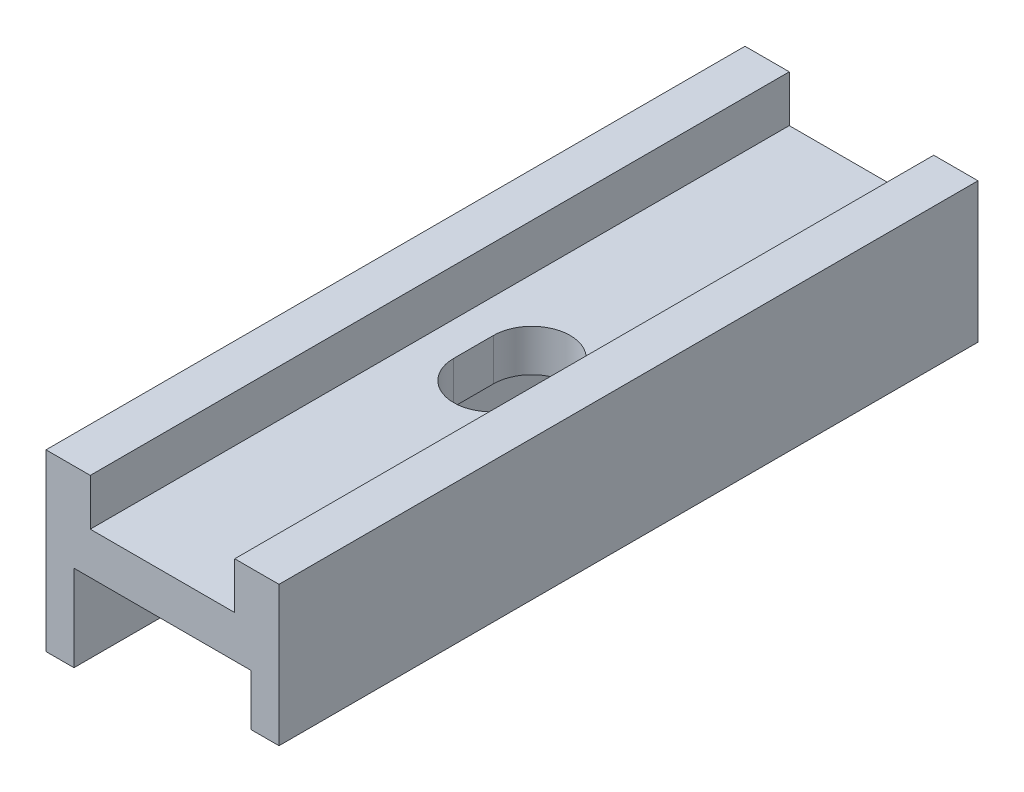
ISO-10303-21;
HEADER;
FILE_DESCRIPTION(('STEP AP214'),'2;1');
FILE_NAME('part.step','',(''),(''),'','','');
FILE_SCHEMA(('AUTOMOTIVE_DESIGN { 1 0 10303 214 1 1 1 1 }'));
ENDSEC;
DATA;
#1=APPLICATION_CONTEXT('core data for automotive mechanical design processes');
#2=APPLICATION_PROTOCOL_DEFINITION('international standard','automotive_design',2000,#1);
#3=PRODUCT_CONTEXT('',#1,'mechanical');
#4=PRODUCT('Part','Part','',(#3));
#5=PRODUCT_RELATED_PRODUCT_CATEGORY('part','',(#4));
#6=PRODUCT_DEFINITION_FORMATION('','',#4);
#7=PRODUCT_DEFINITION_CONTEXT('part definition',#1,'design');
#8=PRODUCT_DEFINITION('design','',#6,#7);
#9=PRODUCT_DEFINITION_SHAPE('','',#8);
#10=(LENGTH_UNIT() NAMED_UNIT(*) SI_UNIT(.MILLI.,.METRE.));
#11=(NAMED_UNIT(*) PLANE_ANGLE_UNIT() SI_UNIT($,.RADIAN.));
#12=(NAMED_UNIT(*) SI_UNIT($,.STERADIAN.) SOLID_ANGLE_UNIT());
#13=UNCERTAINTY_MEASURE_WITH_UNIT(LENGTH_MEASURE(1.E-05),#10,'distance_accuracy_value','');
#14=(GEOMETRIC_REPRESENTATION_CONTEXT(3) GLOBAL_UNCERTAINTY_ASSIGNED_CONTEXT((#13)) GLOBAL_UNIT_ASSIGNED_CONTEXT((#10,
#11,#12)) REPRESENTATION_CONTEXT('',''));
#15=CARTESIAN_POINT('',(0.,0.,0.));
#16=DIRECTION('',(0.,0.,1.));
#17=DIRECTION('',(1.,0.,0.));
#18=AXIS2_PLACEMENT_3D('',#15,#16,#17);
#19=CARTESIAN_POINT('',(7.87400000000001,2.53999999999999,38.1));
#20=DIRECTION('',(-1.,0.,0.));
#21=DIRECTION('',(0.,-1.,0.));
#22=AXIS2_PLACEMENT_3D('',#19,#20,#21);
#23=PLANE('',#22);
#24=DIRECTION('',(0.,1.,0.));
#25=VECTOR('',#24,1.);
#26=CARTESIAN_POINT('',(7.87400000000001,2.53999999999999,-38.1));
#27=LINE('',#26,#25);
#28=CARTESIAN_POINT('',(7.87400000000001,2.53999999999999,-38.1));
#29=VERTEX_POINT('',#28);
#30=CARTESIAN_POINT('',(7.874,7.62,-38.1));
#31=VERTEX_POINT('',#30);
#32=EDGE_CURVE('E159',#29,#31,#27,.T.);
#33=ORIENTED_EDGE('',*,*,#32,.F.);
#34=DIRECTION('',(0.,0.,-1.));
#35=VECTOR('',#34,1.);
#36=CARTESIAN_POINT('',(7.87400000000001,2.53999999999999,38.1));
#37=LINE('',#36,#35);
#38=CARTESIAN_POINT('',(7.87400000000001,2.53999999999999,38.1));
#39=VERTEX_POINT('',#38);
#40=EDGE_CURVE('E11',#39,#29,#37,.T.);
#41=ORIENTED_EDGE('',*,*,#40,.F.);
#42=DIRECTION('',(0.,1.,0.));
#43=VECTOR('',#42,1.);
#44=CARTESIAN_POINT('',(7.87400000000001,2.53999999999999,38.1));
#45=LINE('',#44,#43);
#46=CARTESIAN_POINT('',(7.874,7.62,38.1));
#47=VERTEX_POINT('',#46);
#48=EDGE_CURVE('E198',#39,#47,#45,.T.);
#49=ORIENTED_EDGE('',*,*,#48,.T.);
#50=DIRECTION('',(0.,0.,-1.));
#51=VECTOR('',#50,1.);
#52=CARTESIAN_POINT('',(7.874,7.62,38.1));
#53=LINE('',#52,#51);
#54=EDGE_CURVE('E41',#47,#31,#53,.T.);
#55=ORIENTED_EDGE('',*,*,#54,.T.);
#56=EDGE_LOOP('',(#33,#41,#49,#55));
#57=FACE_BOUND('',#56,.T.);
#58=ADVANCED_FACE('F38',(#57),#23,.T.);
#59=CARTESIAN_POINT('',(-7.87400000000001,2.53999999999999,38.1));
#60=DIRECTION('',(0.,1.,0.));
#61=DIRECTION('',(0.,0.,1.));
#62=AXIS2_PLACEMENT_3D('',#59,#60,#61);
#63=PLANE('',#62);
#64=DIRECTION('',(0.,0.,1.));
#65=VECTOR('',#64,1.);
#66=CARTESIAN_POINT('',(-4.191,2.53999999999999,-2.159));
#67=LINE('',#66,#65);
#68=CARTESIAN_POINT('',(-4.191,2.53999999999999,-2.159));
#69=VERTEX_POINT('',#68);
#70=CARTESIAN_POINT('',(-4.191,2.53999999999999,2.159));
#71=VERTEX_POINT('',#70);
#72=EDGE_CURVE('E55',#69,#71,#67,.T.);
#73=ORIENTED_EDGE('',*,*,#72,.F.);
#74=CARTESIAN_POINT('',(0.,2.53999999999999,-2.159));
#75=DIRECTION('',(0.,1.,0.));
#76=DIRECTION('',(0.,0.,1.));
#77=AXIS2_PLACEMENT_3D('',#74,#75,#76);
#78=CIRCLE('',#77,4.191);
#79=CARTESIAN_POINT('',(4.191,2.53999999999999,-2.159));
#80=VERTEX_POINT('',#79);
#81=EDGE_CURVE('E166',#80,#69,#78,.T.);
#82=ORIENTED_EDGE('',*,*,#81,.F.);
#83=DIRECTION('',(0.,0.,1.));
#84=VECTOR('',#83,1.);
#85=CARTESIAN_POINT('',(4.191,2.53999999999999,-2.159));
#86=LINE('',#85,#84);
#87=CARTESIAN_POINT('',(4.191,2.53999999999999,2.159));
#88=VERTEX_POINT('',#87);
#89=EDGE_CURVE('E184',#80,#88,#86,.T.);
#90=ORIENTED_EDGE('',*,*,#89,.T.);
#91=CARTESIAN_POINT('',(0.,2.53999999999999,2.159));
#92=DIRECTION('',(0.,1.,0.));
#93=DIRECTION('',(0.,0.,1.));
#94=AXIS2_PLACEMENT_3D('',#91,#92,#93);
#95=CIRCLE('',#94,4.191);
#96=EDGE_CURVE('E176',#71,#88,#95,.T.);
#97=ORIENTED_EDGE('',*,*,#96,.F.);
#98=EDGE_LOOP('',(#73,#82,#90,#97));
#99=FACE_BOUND('',#98,.T.);
#100=DIRECTION('',(1.,0.,0.));
#101=VECTOR('',#100,1.);
#102=CARTESIAN_POINT('',(-7.87400000000001,2.53999999999999,-38.1));
#103=LINE('',#102,#101);
#104=CARTESIAN_POINT('',(-7.87400000000001,2.53999999999999,-38.1));
#105=VERTEX_POINT('',#104);
#106=EDGE_CURVE('E203',#105,#29,#103,.T.);
#107=ORIENTED_EDGE('',*,*,#106,.F.);
#108=DIRECTION('',(0.,0.,-1.));
#109=VECTOR('',#108,1.);
#110=CARTESIAN_POINT('',(-7.87400000000001,2.53999999999999,38.1));
#111=LINE('',#110,#109);
#112=CARTESIAN_POINT('',(-7.87400000000001,2.53999999999999,38.1));
#113=VERTEX_POINT('',#112);
#114=EDGE_CURVE('E47',#113,#105,#111,.T.);
#115=ORIENTED_EDGE('',*,*,#114,.F.);
#116=DIRECTION('',(1.,0.,0.));
#117=VECTOR('',#116,1.);
#118=CARTESIAN_POINT('',(-7.87400000000001,2.53999999999999,38.1));
#119=LINE('',#118,#117);
#120=EDGE_CURVE('E243',#113,#39,#119,.T.);
#121=ORIENTED_EDGE('',*,*,#120,.T.);
#122=ORIENTED_EDGE('',*,*,#40,.T.);
#123=EDGE_LOOP('',(#107,#115,#121,#122));
#124=FACE_BOUND('',#123,.T.);
#125=ADVANCED_FACE('F334',(#99,#124),#63,.T.);
#126=CARTESIAN_POINT('',(-7.874,7.62,38.1));
#127=DIRECTION('',(1.,0.,0.));
#128=DIRECTION('',(0.,1.,0.));
#129=AXIS2_PLACEMENT_3D('',#126,#127,#128);
#130=PLANE('',#129);
#131=DIRECTION('',(0.,-1.,0.));
#132=VECTOR('',#131,1.);
#133=CARTESIAN_POINT('',(-7.874,7.62,-38.1));
#134=LINE('',#133,#132);
#135=CARTESIAN_POINT('',(-7.874,7.62,-38.1));
#136=VERTEX_POINT('',#135);
#137=EDGE_CURVE('E286',#136,#105,#134,.T.);
#138=ORIENTED_EDGE('',*,*,#137,.F.);
#139=DIRECTION('',(0.,0.,-1.));
#140=VECTOR('',#139,1.);
#141=CARTESIAN_POINT('',(-7.874,7.62,38.1));
#142=LINE('',#141,#140);
#143=CARTESIAN_POINT('',(-7.874,7.62,38.1));
#144=VERTEX_POINT('',#143);
#145=EDGE_CURVE('E295',#144,#136,#142,.T.);
#146=ORIENTED_EDGE('',*,*,#145,.F.);
#147=DIRECTION('',(0.,-1.,0.));
#148=VECTOR('',#147,1.);
#149=CARTESIAN_POINT('',(-7.874,7.62,38.1));
#150=LINE('',#149,#148);
#151=EDGE_CURVE('E239',#144,#113,#150,.T.);
#152=ORIENTED_EDGE('',*,*,#151,.T.);
#153=ORIENTED_EDGE('',*,*,#114,.T.);
#154=EDGE_LOOP('',(#138,#146,#152,#153));
#155=FACE_BOUND('',#154,.T.);
#156=ADVANCED_FACE('F369',(#155),#130,.T.);
#157=CARTESIAN_POINT('',(-12.7,7.62,38.1));
#158=DIRECTION('',(0.,1.,0.));
#159=DIRECTION('',(0.,0.,1.));
#160=AXIS2_PLACEMENT_3D('',#157,#158,#159);
#161=PLANE('',#160);
#162=DIRECTION('',(1.,0.,0.));
#163=VECTOR('',#162,1.);
#164=CARTESIAN_POINT('',(-12.7,7.62,-38.1));
#165=LINE('',#164,#163);
#166=CARTESIAN_POINT('',(-12.7,7.62,-38.1));
#167=VERTEX_POINT('',#166);
#168=EDGE_CURVE('E282',#167,#136,#165,.T.);
#169=ORIENTED_EDGE('',*,*,#168,.F.);
#170=DIRECTION('',(0.,0.,-1.));
#171=VECTOR('',#170,1.);
#172=CARTESIAN_POINT('',(-12.7,7.62,38.1));
#173=LINE('',#172,#171);
#174=CARTESIAN_POINT('',(-12.7,7.62,38.1));
#175=VERTEX_POINT('',#174);
#176=EDGE_CURVE('E298',#175,#167,#173,.T.);
#177=ORIENTED_EDGE('',*,*,#176,.F.);
#178=DIRECTION('',(1.,0.,0.));
#179=VECTOR('',#178,1.);
#180=CARTESIAN_POINT('',(-12.7,7.62,38.1));
#181=LINE('',#180,#179);
#182=EDGE_CURVE('E235',#175,#144,#181,.T.);
#183=ORIENTED_EDGE('',*,*,#182,.T.);
#184=ORIENTED_EDGE('',*,*,#145,.T.);
#185=EDGE_LOOP('',(#169,#177,#183,#184));
#186=FACE_BOUND('',#185,.T.);
#187=ADVANCED_FACE('F366',(#186),#161,.T.);
#188=CARTESIAN_POINT('',(-12.7,-11.43,38.1));
#189=DIRECTION('',(-1.,0.,0.));
#190=DIRECTION('',(0.,-1.,0.));
#191=AXIS2_PLACEMENT_3D('',#188,#189,#190);
#192=PLANE('',#191);
#193=DIRECTION('',(0.,1.,0.));
#194=VECTOR('',#193,1.);
#195=CARTESIAN_POINT('',(-12.7,-11.43,-38.1));
#196=LINE('',#195,#194);
#197=CARTESIAN_POINT('',(-12.7,-11.43,-38.1));
#198=VERTEX_POINT('',#197);
#199=EDGE_CURVE('E278',#198,#167,#196,.T.);
#200=ORIENTED_EDGE('',*,*,#199,.F.);
#201=DIRECTION('',(0.,0.,-1.));
#202=VECTOR('',#201,1.);
#203=CARTESIAN_POINT('',(-12.7,-11.43,38.1));
#204=LINE('',#203,#202);
#205=CARTESIAN_POINT('',(-12.7,-11.43,38.1));
#206=VERTEX_POINT('',#205);
#207=EDGE_CURVE('E301',#206,#198,#204,.T.);
#208=ORIENTED_EDGE('',*,*,#207,.F.);
#209=DIRECTION('',(0.,1.,0.));
#210=VECTOR('',#209,1.);
#211=CARTESIAN_POINT('',(-12.7,-11.43,38.1));
#212=LINE('',#211,#210);
#213=EDGE_CURVE('E231',#206,#175,#212,.T.);
#214=ORIENTED_EDGE('',*,*,#213,.T.);
#215=ORIENTED_EDGE('',*,*,#176,.T.);
#216=EDGE_LOOP('',(#200,#208,#214,#215));
#217=FACE_BOUND('',#216,.T.);
#218=ADVANCED_FACE('F363',(#217),#192,.T.);
#219=CARTESIAN_POINT('',(-9.652,-11.43,38.1));
#220=DIRECTION('',(0.,-1.,0.));
#221=DIRECTION('',(1.,0.,0.));
#222=AXIS2_PLACEMENT_3D('',#219,#220,#221);
#223=PLANE('',#222);
#224=DIRECTION('',(-1.,0.,0.));
#225=VECTOR('',#224,1.);
#226=CARTESIAN_POINT('',(-9.652,-11.43,-38.1));
#227=LINE('',#226,#225);
#228=CARTESIAN_POINT('',(-9.652,-11.43,-38.1));
#229=VERTEX_POINT('',#228);
#230=EDGE_CURVE('E274',#229,#198,#227,.T.);
#231=ORIENTED_EDGE('',*,*,#230,.F.);
#232=DIRECTION('',(0.,0.,-1.));
#233=VECTOR('',#232,1.);
#234=CARTESIAN_POINT('',(-9.652,-11.43,38.1));
#235=LINE('',#234,#233);
#236=CARTESIAN_POINT('',(-9.652,-11.43,38.1));
#237=VERTEX_POINT('',#236);
#238=EDGE_CURVE('E304',#237,#229,#235,.T.);
#239=ORIENTED_EDGE('',*,*,#238,.F.);
#240=DIRECTION('',(-1.,0.,0.));
#241=VECTOR('',#240,1.);
#242=CARTESIAN_POINT('',(-9.652,-11.43,38.1));
#243=LINE('',#242,#241);
#244=EDGE_CURVE('E227',#237,#206,#243,.T.);
#245=ORIENTED_EDGE('',*,*,#244,.T.);
#246=ORIENTED_EDGE('',*,*,#207,.T.);
#247=EDGE_LOOP('',(#231,#239,#245,#246));
#248=FACE_BOUND('',#247,.T.);
#249=ADVANCED_FACE('F359',(#248),#223,.T.);
#250=CARTESIAN_POINT('',(-9.652,-2.03200000000001,38.1));
#251=DIRECTION('',(1.,0.,0.));
#252=DIRECTION('',(0.,1.,0.));
#253=AXIS2_PLACEMENT_3D('',#250,#251,#252);
#254=PLANE('',#253);
#255=DIRECTION('',(0.,-1.,0.));
#256=VECTOR('',#255,1.);
#257=CARTESIAN_POINT('',(-9.652,-2.03200000000001,-38.1));
#258=LINE('',#257,#256);
#259=CARTESIAN_POINT('',(-9.652,-2.03200000000001,-38.1));
#260=VERTEX_POINT('',#259);
#261=EDGE_CURVE('E270',#260,#229,#258,.T.);
#262=ORIENTED_EDGE('',*,*,#261,.F.);
#263=DIRECTION('',(0.,0.,-1.));
#264=VECTOR('',#263,1.);
#265=CARTESIAN_POINT('',(-9.652,-2.03200000000001,38.1));
#266=LINE('',#265,#264);
#267=CARTESIAN_POINT('',(-9.652,-2.03200000000001,38.1));
#268=VERTEX_POINT('',#267);
#269=EDGE_CURVE('E307',#268,#260,#266,.T.);
#270=ORIENTED_EDGE('',*,*,#269,.F.);
#271=DIRECTION('',(0.,-1.,0.));
#272=VECTOR('',#271,1.);
#273=CARTESIAN_POINT('',(-9.652,-2.03200000000001,38.1));
#274=LINE('',#273,#272);
#275=EDGE_CURVE('E223',#268,#237,#274,.T.);
#276=ORIENTED_EDGE('',*,*,#275,.T.);
#277=ORIENTED_EDGE('',*,*,#238,.T.);
#278=EDGE_LOOP('',(#262,#270,#276,#277));
#279=FACE_BOUND('',#278,.T.);
#280=ADVANCED_FACE('F355',(#279),#254,.T.);
#281=CARTESIAN_POINT('',(9.65199999999999,-2.03200000000001,38.1));
#282=DIRECTION('',(0.,-1.,0.));
#283=DIRECTION('',(1.,0.,0.));
#284=AXIS2_PLACEMENT_3D('',#281,#282,#283);
#285=PLANE('',#284);
#286=DIRECTION('',(0.,0.,1.));
#287=VECTOR('',#286,1.);
#288=CARTESIAN_POINT('',(-4.191,-2.03200000000001,-2.159));
#289=LINE('',#288,#287);
#290=CARTESIAN_POINT('',(-4.191,-2.03200000000001,-2.159));
#291=VERTEX_POINT('',#290);
#292=CARTESIAN_POINT('',(-4.191,-2.03200000000001,2.159));
#293=VERTEX_POINT('',#292);
#294=EDGE_CURVE('E163',#291,#293,#289,.T.);
#295=ORIENTED_EDGE('',*,*,#294,.T.);
#296=CARTESIAN_POINT('',(0.,-2.03200000000001,2.159));
#297=DIRECTION('',(0.,-1.,0.));
#298=DIRECTION('',(1.,0.,0.));
#299=AXIS2_PLACEMENT_3D('',#296,#297,#298);
#300=CIRCLE('',#299,4.191);
#301=CARTESIAN_POINT('',(4.191,-2.03200000000001,2.159));
#302=VERTEX_POINT('',#301);
#303=EDGE_CURVE('E151',#293,#302,#300,.F.);
#304=ORIENTED_EDGE('',*,*,#303,.T.);
#305=DIRECTION('',(0.,0.,1.));
#306=VECTOR('',#305,1.);
#307=CARTESIAN_POINT('',(4.191,-2.03200000000001,-2.159));
#308=LINE('',#307,#306);
#309=CARTESIAN_POINT('',(4.191,-2.03200000000001,-2.159));
#310=VERTEX_POINT('',#309);
#311=EDGE_CURVE('E178',#310,#302,#308,.T.);
#312=ORIENTED_EDGE('',*,*,#311,.F.);
#313=CARTESIAN_POINT('',(0.,-2.03200000000001,-2.159));
#314=DIRECTION('',(0.,-1.,0.));
#315=DIRECTION('',(1.,0.,0.));
#316=AXIS2_PLACEMENT_3D('',#313,#314,#315);
#317=CIRCLE('',#316,4.191);
#318=EDGE_CURVE('E171',#310,#291,#317,.F.);
#319=ORIENTED_EDGE('',*,*,#318,.T.);
#320=EDGE_LOOP('',(#295,#304,#312,#319));
#321=FACE_BOUND('',#320,.T.);
#322=DIRECTION('',(-1.,0.,0.));
#323=VECTOR('',#322,1.);
#324=CARTESIAN_POINT('',(9.65199999999999,-2.03200000000001,-38.1));
#325=LINE('',#324,#323);
#326=CARTESIAN_POINT('',(9.65199999999999,-2.03200000000001,-38.1));
#327=VERTEX_POINT('',#326);
#328=EDGE_CURVE('E266',#327,#260,#325,.T.);
#329=ORIENTED_EDGE('',*,*,#328,.F.);
#330=DIRECTION('',(0.,0.,-1.));
#331=VECTOR('',#330,1.);
#332=CARTESIAN_POINT('',(9.65199999999999,-2.03200000000001,38.1));
#333=LINE('',#332,#331);
#334=CARTESIAN_POINT('',(9.65199999999999,-2.03200000000001,38.1));
#335=VERTEX_POINT('',#334);
#336=EDGE_CURVE('E310',#335,#327,#333,.T.);
#337=ORIENTED_EDGE('',*,*,#336,.F.);
#338=DIRECTION('',(-1.,0.,0.));
#339=VECTOR('',#338,1.);
#340=CARTESIAN_POINT('',(9.65199999999999,-2.03200000000001,38.1));
#341=LINE('',#340,#339);
#342=EDGE_CURVE('E219',#335,#268,#341,.T.);
#343=ORIENTED_EDGE('',*,*,#342,.T.);
#344=ORIENTED_EDGE('',*,*,#269,.T.);
#345=EDGE_LOOP('',(#329,#337,#343,#344));
#346=FACE_BOUND('',#345,.T.);
#347=ADVANCED_FACE('F169',(#321,#346),#285,.T.);
#348=CARTESIAN_POINT('',(9.652,-7.61999999999999,38.1));
#349=DIRECTION('',(-1.,0.,0.));
#350=DIRECTION('',(0.,-1.,0.));
#351=AXIS2_PLACEMENT_3D('',#348,#349,#350);
#352=PLANE('',#351);
#353=DIRECTION('',(0.,1.,0.));
#354=VECTOR('',#353,1.);
#355=CARTESIAN_POINT('',(9.652,-7.61999999999999,-38.1));
#356=LINE('',#355,#354);
#357=CARTESIAN_POINT('',(9.652,-7.61999999999999,-38.1));
#358=VERTEX_POINT('',#357);
#359=EDGE_CURVE('E262',#358,#327,#356,.T.);
#360=ORIENTED_EDGE('',*,*,#359,.F.);
#361=DIRECTION('',(0.,0.,-1.));
#362=VECTOR('',#361,1.);
#363=CARTESIAN_POINT('',(9.652,-7.61999999999999,38.1));
#364=LINE('',#363,#362);
#365=CARTESIAN_POINT('',(9.652,-7.61999999999999,38.1));
#366=VERTEX_POINT('',#365);
#367=EDGE_CURVE('E313',#366,#358,#364,.T.);
#368=ORIENTED_EDGE('',*,*,#367,.F.);
#369=DIRECTION('',(0.,1.,0.));
#370=VECTOR('',#369,1.);
#371=CARTESIAN_POINT('',(9.652,-7.61999999999999,38.1));
#372=LINE('',#371,#370);
#373=EDGE_CURVE('E215',#366,#335,#372,.T.);
#374=ORIENTED_EDGE('',*,*,#373,.T.);
#375=ORIENTED_EDGE('',*,*,#336,.T.);
#376=EDGE_LOOP('',(#360,#368,#374,#375));
#377=FACE_BOUND('',#376,.T.);
#378=ADVANCED_FACE('F349',(#377),#352,.T.);
#379=CARTESIAN_POINT('',(12.7,-7.61999999999999,38.1));
#380=DIRECTION('',(0.,-1.,0.));
#381=DIRECTION('',(1.,0.,0.));
#382=AXIS2_PLACEMENT_3D('',#379,#380,#381);
#383=PLANE('',#382);
#384=DIRECTION('',(-1.,0.,0.));
#385=VECTOR('',#384,1.);
#386=CARTESIAN_POINT('',(12.7,-7.61999999999999,-38.1));
#387=LINE('',#386,#385);
#388=CARTESIAN_POINT('',(12.7,-7.61999999999999,-38.1));
#389=VERTEX_POINT('',#388);
#390=EDGE_CURVE('E258',#389,#358,#387,.T.);
#391=ORIENTED_EDGE('',*,*,#390,.F.);
#392=DIRECTION('',(0.,0.,-1.));
#393=VECTOR('',#392,1.);
#394=CARTESIAN_POINT('',(12.7,-7.61999999999999,38.1));
#395=LINE('',#394,#393);
#396=CARTESIAN_POINT('',(12.7,-7.61999999999999,38.1));
#397=VERTEX_POINT('',#396);
#398=EDGE_CURVE('E316',#397,#389,#395,.T.);
#399=ORIENTED_EDGE('',*,*,#398,.F.);
#400=DIRECTION('',(-1.,0.,0.));
#401=VECTOR('',#400,1.);
#402=CARTESIAN_POINT('',(12.7,-7.61999999999999,38.1));
#403=LINE('',#402,#401);
#404=EDGE_CURVE('E211',#397,#366,#403,.T.);
#405=ORIENTED_EDGE('',*,*,#404,.T.);
#406=ORIENTED_EDGE('',*,*,#367,.T.);
#407=EDGE_LOOP('',(#391,#399,#405,#406));
#408=FACE_BOUND('',#407,.T.);
#409=ADVANCED_FACE('F347',(#408),#383,.T.);
#410=CARTESIAN_POINT('',(12.7,7.61999999999999,38.1));
#411=DIRECTION('',(1.,0.,0.));
#412=DIRECTION('',(0.,1.,0.));
#413=AXIS2_PLACEMENT_3D('',#410,#411,#412);
#414=PLANE('',#413);
#415=DIRECTION('',(0.,-1.,0.));
#416=VECTOR('',#415,1.);
#417=CARTESIAN_POINT('',(12.7,7.61999999999999,-38.1));
#418=LINE('',#417,#416);
#419=CARTESIAN_POINT('',(12.7,7.61999999999999,-38.1));
#420=VERTEX_POINT('',#419);
#421=EDGE_CURVE('E254',#420,#389,#418,.T.);
#422=ORIENTED_EDGE('',*,*,#421,.F.);
#423=DIRECTION('',(0.,0.,-1.));
#424=VECTOR('',#423,1.);
#425=CARTESIAN_POINT('',(12.7,7.61999999999999,38.1));
#426=LINE('',#425,#424);
#427=CARTESIAN_POINT('',(12.7,7.61999999999999,38.1));
#428=VERTEX_POINT('',#427);
#429=EDGE_CURVE('E318',#428,#420,#426,.T.);
#430=ORIENTED_EDGE('',*,*,#429,.F.);
#431=DIRECTION('',(0.,-1.,0.));
#432=VECTOR('',#431,1.);
#433=CARTESIAN_POINT('',(12.7,7.61999999999999,38.1));
#434=LINE('',#433,#432);
#435=EDGE_CURVE('E207',#428,#397,#434,.T.);
#436=ORIENTED_EDGE('',*,*,#435,.T.);
#437=ORIENTED_EDGE('',*,*,#398,.T.);
#438=EDGE_LOOP('',(#422,#430,#436,#437));
#439=FACE_BOUND('',#438,.T.);
#440=ADVANCED_FACE('F343',(#439),#414,.T.);
#441=CARTESIAN_POINT('',(7.874,7.62,38.1));
#442=DIRECTION('',(0.,1.,0.));
#443=DIRECTION('',(-1.,0.,0.));
#444=AXIS2_PLACEMENT_3D('',#441,#442,#443);
#445=PLANE('',#444);
#446=DIRECTION('',(1.,0.,0.));
#447=VECTOR('',#446,1.);
#448=CARTESIAN_POINT('',(7.874,7.62,-38.1));
#449=LINE('',#448,#447);
#450=EDGE_CURVE('E250',#31,#420,#449,.T.);
#451=ORIENTED_EDGE('',*,*,#450,.F.);
#452=ORIENTED_EDGE('',*,*,#54,.F.);
#453=DIRECTION('',(1.,0.,0.));
#454=VECTOR('',#453,1.);
#455=CARTESIAN_POINT('',(7.874,7.62,38.1));
#456=LINE('',#455,#454);
#457=EDGE_CURVE('E202',#47,#428,#456,.T.);
#458=ORIENTED_EDGE('',*,*,#457,.T.);
#459=ORIENTED_EDGE('',*,*,#429,.T.);
#460=EDGE_LOOP('',(#451,#452,#458,#459));
#461=FACE_BOUND('',#460,.T.);
#462=ADVANCED_FACE('F328',(#461),#445,.T.);
#463=CARTESIAN_POINT('',(0.,0.,38.1));
#464=DIRECTION('',(0.,0.,-1.));
#465=DIRECTION('',(-1.,0.,0.));
#466=AXIS2_PLACEMENT_3D('',#463,#464,#465);
#467=PLANE('',#466);
#468=ORIENTED_EDGE('',*,*,#48,.F.);
#469=ORIENTED_EDGE('',*,*,#120,.F.);
#470=ORIENTED_EDGE('',*,*,#151,.F.);
#471=ORIENTED_EDGE('',*,*,#182,.F.);
#472=ORIENTED_EDGE('',*,*,#213,.F.);
#473=ORIENTED_EDGE('',*,*,#244,.F.);
#474=ORIENTED_EDGE('',*,*,#275,.F.);
#475=ORIENTED_EDGE('',*,*,#342,.F.);
#476=ORIENTED_EDGE('',*,*,#373,.F.);
#477=ORIENTED_EDGE('',*,*,#404,.F.);
#478=ORIENTED_EDGE('',*,*,#435,.F.);
#479=ORIENTED_EDGE('',*,*,#457,.F.);
#480=EDGE_LOOP('',(#468,#469,#470,#471,#472,#473,#474,#475,#476,#477,#478,#479));
#481=FACE_BOUND('',#480,.T.);
#482=ADVANCED_FACE('F337',(#481),#467,.F.);
#483=CARTESIAN_POINT('',(0.,0.,-38.1));
#484=DIRECTION('',(0.,0.,-1.));
#485=DIRECTION('',(-1.,0.,0.));
#486=AXIS2_PLACEMENT_3D('',#483,#484,#485);
#487=PLANE('',#486);
#488=ORIENTED_EDGE('',*,*,#32,.T.);
#489=ORIENTED_EDGE('',*,*,#450,.T.);
#490=ORIENTED_EDGE('',*,*,#421,.T.);
#491=ORIENTED_EDGE('',*,*,#390,.T.);
#492=ORIENTED_EDGE('',*,*,#359,.T.);
#493=ORIENTED_EDGE('',*,*,#328,.T.);
#494=ORIENTED_EDGE('',*,*,#261,.T.);
#495=ORIENTED_EDGE('',*,*,#230,.T.);
#496=ORIENTED_EDGE('',*,*,#199,.T.);
#497=ORIENTED_EDGE('',*,*,#168,.T.);
#498=ORIENTED_EDGE('',*,*,#137,.T.);
#499=ORIENTED_EDGE('',*,*,#106,.T.);
#500=EDGE_LOOP('',(#488,#489,#490,#491,#492,#493,#494,#495,#496,#497,#498,#499));
#501=FACE_BOUND('',#500,.T.);
#502=ADVANCED_FACE('F330',(#501),#487,.T.);
#503=CARTESIAN_POINT('',(-4.191,-11.431,-2.159));
#504=DIRECTION('',(-1.,0.,0.));
#505=DIRECTION('',(0.,0.,1.));
#506=AXIS2_PLACEMENT_3D('',#503,#504,#505);
#507=PLANE('',#506);
#508=DIRECTION('',(0.,1.,0.));
#509=VECTOR('',#508,1.);
#510=CARTESIAN_POINT('',(-4.191,-11.431,-2.159));
#511=LINE('',#510,#509);
#512=EDGE_CURVE('E160',#291,#69,#511,.T.);
#513=ORIENTED_EDGE('',*,*,#512,.T.);
#514=ORIENTED_EDGE('',*,*,#72,.T.);
#515=DIRECTION('',(0.,1.,0.));
#516=VECTOR('',#515,1.);
#517=CARTESIAN_POINT('',(-4.191,-11.431,2.159));
#518=LINE('',#517,#516);
#519=EDGE_CURVE('E153',#293,#71,#518,.T.);
#520=ORIENTED_EDGE('',*,*,#519,.F.);
#521=ORIENTED_EDGE('',*,*,#294,.F.);
#522=EDGE_LOOP('',(#513,#514,#520,#521));
#523=FACE_BOUND('',#522,.T.);
#524=ADVANCED_FACE('F162',(#523),#507,.F.);
#525=CARTESIAN_POINT('',(0.,-11.431,-2.159));
#526=DIRECTION('',(0.,1.,0.));
#527=DIRECTION('',(0.,0.,1.));
#528=AXIS2_PLACEMENT_3D('',#525,#526,#527);
#529=CYLINDRICAL_SURFACE('',#528,4.191);
#530=DIRECTION('',(0.,1.,0.));
#531=VECTOR('',#530,1.);
#532=CARTESIAN_POINT('',(4.191,-11.431,-2.159));
#533=LINE('',#532,#531);
#534=EDGE_CURVE('E193',#310,#80,#533,.T.);
#535=ORIENTED_EDGE('',*,*,#534,.T.);
#536=ORIENTED_EDGE('',*,*,#81,.T.);
#537=ORIENTED_EDGE('',*,*,#512,.F.);
#538=ORIENTED_EDGE('',*,*,#318,.F.);
#539=EDGE_LOOP('',(#535,#536,#537,#538));
#540=FACE_BOUND('',#539,.T.);
#541=ADVANCED_FACE('F409',(#540),#529,.F.);
#542=CARTESIAN_POINT('',(4.191,-11.431,-2.159));
#543=DIRECTION('',(-1.,0.,0.));
#544=DIRECTION('',(0.,0.,1.));
#545=AXIS2_PLACEMENT_3D('',#542,#543,#544);
#546=PLANE('',#545);
#547=ORIENTED_EDGE('',*,*,#311,.T.);
#548=DIRECTION('',(0.,1.,0.));
#549=VECTOR('',#548,1.);
#550=CARTESIAN_POINT('',(4.191,-11.431,2.159));
#551=LINE('',#550,#549);
#552=EDGE_CURVE('E63',#302,#88,#551,.T.);
#553=ORIENTED_EDGE('',*,*,#552,.T.);
#554=ORIENTED_EDGE('',*,*,#89,.F.);
#555=ORIENTED_EDGE('',*,*,#534,.F.);
#556=EDGE_LOOP('',(#547,#553,#554,#555));
#557=FACE_BOUND('',#556,.T.);
#558=ADVANCED_FACE('F418',(#557),#546,.T.);
#559=CARTESIAN_POINT('',(0.,-11.431,2.159));
#560=DIRECTION('',(0.,1.,0.));
#561=DIRECTION('',(0.,0.,1.));
#562=AXIS2_PLACEMENT_3D('',#559,#560,#561);
#563=CYLINDRICAL_SURFACE('',#562,4.191);
#564=ORIENTED_EDGE('',*,*,#519,.T.);
#565=ORIENTED_EDGE('',*,*,#96,.T.);
#566=ORIENTED_EDGE('',*,*,#552,.F.);
#567=ORIENTED_EDGE('',*,*,#303,.F.);
#568=EDGE_LOOP('',(#564,#565,#566,#567));
#569=FACE_BOUND('',#568,.T.);
#570=ADVANCED_FACE('F152',(#569),#563,.F.);
#571=CLOSED_SHELL('',(#58,#125,#156,#187,#218,#249,#280,#347,#378,#409,#440,#462,#482,#502,#524,
#541,#558,#570));
#572=MANIFOLD_SOLID_BREP('B2',#571);
#573=ADVANCED_BREP_SHAPE_REPRESENTATION('',(#18,#572),#14);
#574=SHAPE_DEFINITION_REPRESENTATION(#9,#573);
ENDSEC;
END-ISO-10303-21;
